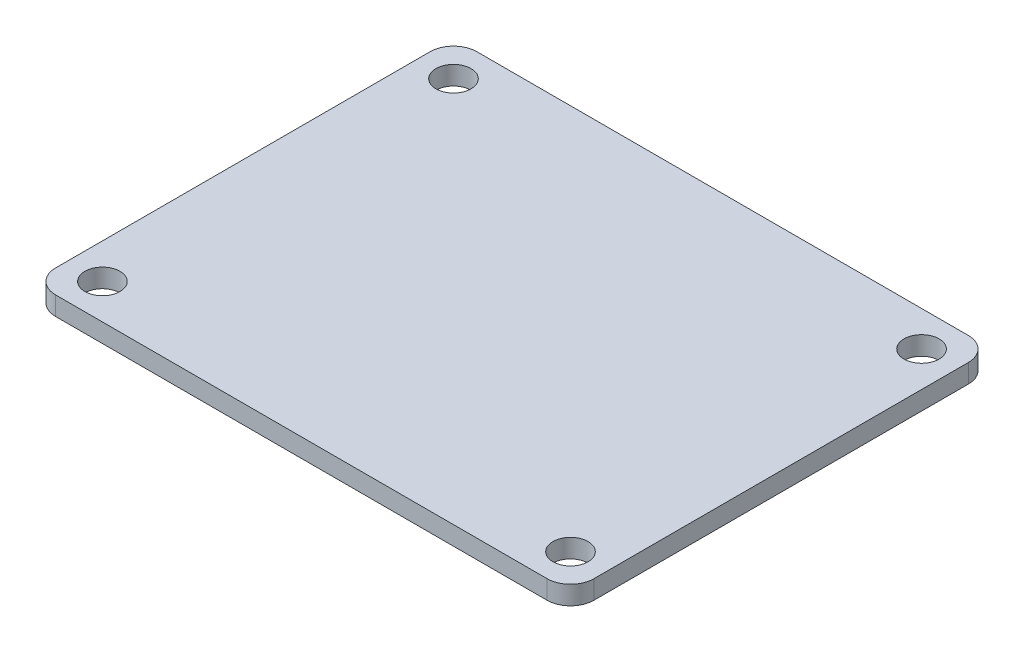
ISO-10303-21;
HEADER;
FILE_DESCRIPTION(('STEP AP214'),'2;1');
FILE_NAME('part.step','',(''),(''),'','','');
FILE_SCHEMA(('AUTOMOTIVE_DESIGN { 1 0 10303 214 1 1 1 1 }'));
ENDSEC;
DATA;
#1=APPLICATION_CONTEXT('core data for automotive mechanical design processes');
#2=APPLICATION_PROTOCOL_DEFINITION('international standard','automotive_design',2000,#1);
#3=PRODUCT_CONTEXT('',#1,'mechanical');
#4=PRODUCT('Part','Part','',(#3));
#5=PRODUCT_RELATED_PRODUCT_CATEGORY('part','',(#4));
#6=PRODUCT_DEFINITION_FORMATION('','',#4);
#7=PRODUCT_DEFINITION_CONTEXT('part definition',#1,'design');
#8=PRODUCT_DEFINITION('design','',#6,#7);
#9=PRODUCT_DEFINITION_SHAPE('','',#8);
#10=(LENGTH_UNIT() NAMED_UNIT(*) SI_UNIT(.MILLI.,.METRE.));
#11=(NAMED_UNIT(*) PLANE_ANGLE_UNIT() SI_UNIT($,.RADIAN.));
#12=(NAMED_UNIT(*) SI_UNIT($,.STERADIAN.) SOLID_ANGLE_UNIT());
#13=UNCERTAINTY_MEASURE_WITH_UNIT(LENGTH_MEASURE(1.E-05),#10,'distance_accuracy_value','');
#14=(GEOMETRIC_REPRESENTATION_CONTEXT(3) GLOBAL_UNCERTAINTY_ASSIGNED_CONTEXT((#13)) GLOBAL_UNIT_ASSIGNED_CONTEXT((#10,
#11,#12)) REPRESENTATION_CONTEXT('',''));
#15=CARTESIAN_POINT('',(0.,0.,0.));
#16=DIRECTION('',(0.,0.,1.));
#17=DIRECTION('',(1.,0.,0.));
#18=AXIS2_PLACEMENT_3D('',#15,#16,#17);
#19=CARTESIAN_POINT('',(0.,1.6,0.));
#20=DIRECTION('',(0.,-1.,0.));
#21=DIRECTION('',(0.,0.,-1.));
#22=AXIS2_PLACEMENT_3D('',#19,#20,#21);
#23=PLANE('',#22);
#24=DIRECTION('',(0.,0.,1.));
#25=VECTOR('',#24,1.);
#26=CARTESIAN_POINT('',(-23.,1.6,-18.));
#27=LINE('',#26,#25);
#28=CARTESIAN_POINT('',(-23.,1.6,-16.));
#29=VERTEX_POINT('',#28);
#30=CARTESIAN_POINT('',(-23.,1.6,16.));
#31=VERTEX_POINT('',#30);
#32=EDGE_CURVE('E171',#29,#31,#27,.T.);
#33=ORIENTED_EDGE('',*,*,#32,.T.);
#34=CARTESIAN_POINT('',(-21.,1.6,16.));
#35=DIRECTION('',(0.,-1.,0.));
#36=DIRECTION('',(0.,0.,-1.));
#37=AXIS2_PLACEMENT_3D('',#34,#35,#36);
#38=CIRCLE('',#37,2.);
#39=CARTESIAN_POINT('',(-21.,1.6,18.));
#40=VERTEX_POINT('',#39);
#41=EDGE_CURVE('E149',#31,#40,#38,.F.);
#42=ORIENTED_EDGE('',*,*,#41,.T.);
#43=DIRECTION('',(1.,0.,0.));
#44=VECTOR('',#43,1.);
#45=CARTESIAN_POINT('',(-23.,1.6,18.));
#46=LINE('',#45,#44);
#47=CARTESIAN_POINT('',(21.,1.6,18.));
#48=VERTEX_POINT('',#47);
#49=EDGE_CURVE('E119',#40,#48,#46,.T.);
#50=ORIENTED_EDGE('',*,*,#49,.T.);
#51=CARTESIAN_POINT('',(21.,1.6,16.));
#52=DIRECTION('',(0.,-1.,0.));
#53=DIRECTION('',(0.,0.,-1.));
#54=AXIS2_PLACEMENT_3D('',#51,#52,#53);
#55=CIRCLE('',#54,2.);
#56=CARTESIAN_POINT('',(23.,1.6,16.));
#57=VERTEX_POINT('',#56);
#58=EDGE_CURVE('E55',#48,#57,#55,.F.);
#59=ORIENTED_EDGE('',*,*,#58,.T.);
#60=DIRECTION('',(0.,0.,-1.));
#61=VECTOR('',#60,1.);
#62=CARTESIAN_POINT('',(23.,1.6,-18.));
#63=LINE('',#62,#61);
#64=CARTESIAN_POINT('',(23.,1.6,-16.));
#65=VERTEX_POINT('',#64);
#66=EDGE_CURVE('E135',#57,#65,#63,.T.);
#67=ORIENTED_EDGE('',*,*,#66,.T.);
#68=CARTESIAN_POINT('',(21.,1.6,-16.));
#69=DIRECTION('',(0.,-1.,0.));
#70=DIRECTION('',(0.,0.,-1.));
#71=AXIS2_PLACEMENT_3D('',#68,#69,#70);
#72=CIRCLE('',#71,2.);
#73=CARTESIAN_POINT('',(21.,1.6,-18.));
#74=VERTEX_POINT('',#73);
#75=EDGE_CURVE('E145',#65,#74,#72,.F.);
#76=ORIENTED_EDGE('',*,*,#75,.T.);
#77=DIRECTION('',(-1.,0.,0.));
#78=VECTOR('',#77,1.);
#79=CARTESIAN_POINT('',(-23.,1.6,-18.));
#80=LINE('',#79,#78);
#81=CARTESIAN_POINT('',(-21.,1.6,-18.));
#82=VERTEX_POINT('',#81);
#83=EDGE_CURVE('E129',#74,#82,#80,.T.);
#84=ORIENTED_EDGE('',*,*,#83,.T.);
#85=CARTESIAN_POINT('',(-21.,1.6,-16.));
#86=DIRECTION('',(0.,-1.,0.));
#87=DIRECTION('',(0.,0.,-1.));
#88=AXIS2_PLACEMENT_3D('',#85,#86,#87);
#89=CIRCLE('',#88,2.);
#90=EDGE_CURVE('E147',#82,#29,#89,.F.);
#91=ORIENTED_EDGE('',*,*,#90,.T.);
#92=EDGE_LOOP('',(#33,#42,#50,#59,#67,#76,#84,#91));
#93=FACE_BOUND('',#92,.T.);
#94=CARTESIAN_POINT('',(-20.,1.6,-15.));
#95=DIRECTION('',(0.,1.,0.));
#96=DIRECTION('',(0.,0.,1.));
#97=AXIS2_PLACEMENT_3D('',#94,#95,#96);
#98=CIRCLE('',#97,1.5);
#99=CARTESIAN_POINT('',(-20.,1.6,-13.5));
#100=VERTEX_POINT('',#99);
#101=EDGE_CURVE('E180',#100,#100,#98,.T.);
#102=ORIENTED_EDGE('',*,*,#101,.F.);
#103=EDGE_LOOP('',(#102));
#104=FACE_BOUND('',#103,.T.);
#105=CARTESIAN_POINT('',(20.,1.6,-15.));
#106=DIRECTION('',(0.,1.,0.));
#107=DIRECTION('',(0.,0.,-1.));
#108=AXIS2_PLACEMENT_3D('',#105,#106,#107);
#109=CIRCLE('',#108,1.49999999999998);
#110=CARTESIAN_POINT('',(20.,1.6,-16.5));
#111=VERTEX_POINT('',#110);
#112=EDGE_CURVE('E185',#111,#111,#109,.T.);
#113=ORIENTED_EDGE('',*,*,#112,.F.);
#114=EDGE_LOOP('',(#113));
#115=FACE_BOUND('',#114,.T.);
#116=CARTESIAN_POINT('',(-20.,1.6,15.));
#117=DIRECTION('',(0.,1.,0.));
#118=DIRECTION('',(0.,0.,-1.));
#119=AXIS2_PLACEMENT_3D('',#116,#117,#118);
#120=CIRCLE('',#119,1.5);
#121=CARTESIAN_POINT('',(-20.,1.6,13.5));
#122=VERTEX_POINT('',#121);
#123=EDGE_CURVE('E190',#122,#122,#120,.T.);
#124=ORIENTED_EDGE('',*,*,#123,.F.);
#125=EDGE_LOOP('',(#124));
#126=FACE_BOUND('',#125,.T.);
#127=CARTESIAN_POINT('',(20.,1.6,15.));
#128=DIRECTION('',(0.,1.,0.));
#129=DIRECTION('',(0.,0.,1.));
#130=AXIS2_PLACEMENT_3D('',#127,#128,#129);
#131=CIRCLE('',#130,1.49999999999999);
#132=CARTESIAN_POINT('',(20.,1.6,16.5));
#133=VERTEX_POINT('',#132);
#134=EDGE_CURVE('E196',#133,#133,#131,.T.);
#135=ORIENTED_EDGE('',*,*,#134,.F.);
#136=EDGE_LOOP('',(#135));
#137=FACE_BOUND('',#136,.T.);
#138=ADVANCED_FACE('F35',(#93,#104,#115,#126,#137),#23,.F.);
#139=CARTESIAN_POINT('',(0.,0.,0.));
#140=DIRECTION('',(0.,-1.,0.));
#141=DIRECTION('',(0.,0.,-1.));
#142=AXIS2_PLACEMENT_3D('',#139,#140,#141);
#143=PLANE('',#142);
#144=CARTESIAN_POINT('',(-20.,0.,15.));
#145=DIRECTION('',(0.,1.,0.));
#146=DIRECTION('',(0.,0.,-1.));
#147=AXIS2_PLACEMENT_3D('',#144,#145,#146);
#148=CIRCLE('',#147,1.5);
#149=CARTESIAN_POINT('',(-20.,0.,13.5));
#150=VERTEX_POINT('',#149);
#151=EDGE_CURVE('E193',#150,#150,#148,.T.);
#152=ORIENTED_EDGE('',*,*,#151,.T.);
#153=EDGE_LOOP('',(#152));
#154=FACE_BOUND('',#153,.T.);
#155=CARTESIAN_POINT('',(-20.,0.,-15.));
#156=DIRECTION('',(0.,1.,0.));
#157=DIRECTION('',(0.,0.,1.));
#158=AXIS2_PLACEMENT_3D('',#155,#156,#157);
#159=CIRCLE('',#158,1.5);
#160=CARTESIAN_POINT('',(-20.,0.,-13.5));
#161=VERTEX_POINT('',#160);
#162=EDGE_CURVE('E176',#161,#161,#159,.T.);
#163=ORIENTED_EDGE('',*,*,#162,.T.);
#164=EDGE_LOOP('',(#163));
#165=FACE_BOUND('',#164,.T.);
#166=DIRECTION('',(1.,0.,0.));
#167=VECTOR('',#166,1.);
#168=CARTESIAN_POINT('',(-23.,0.,18.));
#169=LINE('',#168,#167);
#170=CARTESIAN_POINT('',(-21.,0.,18.));
#171=VERTEX_POINT('',#170);
#172=CARTESIAN_POINT('',(21.,0.,18.));
#173=VERTEX_POINT('',#172);
#174=EDGE_CURVE('E117',#171,#173,#169,.T.);
#175=ORIENTED_EDGE('',*,*,#174,.F.);
#176=CARTESIAN_POINT('',(-21.,0.,16.));
#177=DIRECTION('',(0.,-1.,0.));
#178=DIRECTION('',(0.,0.,-1.));
#179=AXIS2_PLACEMENT_3D('',#176,#177,#178);
#180=CIRCLE('',#179,2.);
#181=CARTESIAN_POINT('',(-23.,0.,16.));
#182=VERTEX_POINT('',#181);
#183=EDGE_CURVE('E100',#171,#182,#180,.T.);
#184=ORIENTED_EDGE('',*,*,#183,.T.);
#185=DIRECTION('',(0.,0.,1.));
#186=VECTOR('',#185,1.);
#187=CARTESIAN_POINT('',(-23.,0.,-18.));
#188=LINE('',#187,#186);
#189=CARTESIAN_POINT('',(-23.,0.,-16.));
#190=VERTEX_POINT('',#189);
#191=EDGE_CURVE('E127',#190,#182,#188,.T.);
#192=ORIENTED_EDGE('',*,*,#191,.F.);
#193=CARTESIAN_POINT('',(-21.,0.,-16.));
#194=DIRECTION('',(0.,-1.,0.));
#195=DIRECTION('',(0.,0.,-1.));
#196=AXIS2_PLACEMENT_3D('',#193,#194,#195);
#197=CIRCLE('',#196,2.);
#198=CARTESIAN_POINT('',(-21.,0.,-18.));
#199=VERTEX_POINT('',#198);
#200=EDGE_CURVE('E111',#190,#199,#197,.T.);
#201=ORIENTED_EDGE('',*,*,#200,.T.);
#202=DIRECTION('',(-1.,0.,0.));
#203=VECTOR('',#202,1.);
#204=CARTESIAN_POINT('',(-23.,0.,-18.));
#205=LINE('',#204,#203);
#206=CARTESIAN_POINT('',(21.,0.,-18.));
#207=VERTEX_POINT('',#206);
#208=EDGE_CURVE('E131',#207,#199,#205,.T.);
#209=ORIENTED_EDGE('',*,*,#208,.F.);
#210=CARTESIAN_POINT('',(21.,0.,-16.));
#211=DIRECTION('',(0.,-1.,0.));
#212=DIRECTION('',(0.,0.,-1.));
#213=AXIS2_PLACEMENT_3D('',#210,#211,#212);
#214=CIRCLE('',#213,2.);
#215=CARTESIAN_POINT('',(23.,0.,-16.));
#216=VERTEX_POINT('',#215);
#217=EDGE_CURVE('E138',#207,#216,#214,.T.);
#218=ORIENTED_EDGE('',*,*,#217,.T.);
#219=DIRECTION('',(0.,0.,-1.));
#220=VECTOR('',#219,1.);
#221=CARTESIAN_POINT('',(23.,0.,-18.));
#222=LINE('',#221,#220);
#223=CARTESIAN_POINT('',(23.,0.,16.));
#224=VERTEX_POINT('',#223);
#225=EDGE_CURVE('E126',#224,#216,#222,.T.);
#226=ORIENTED_EDGE('',*,*,#225,.F.);
#227=CARTESIAN_POINT('',(21.,0.,16.));
#228=DIRECTION('',(0.,-1.,0.));
#229=DIRECTION('',(0.,0.,-1.));
#230=AXIS2_PLACEMENT_3D('',#227,#228,#229);
#231=CIRCLE('',#230,2.);
#232=EDGE_CURVE('E120',#224,#173,#231,.T.);
#233=ORIENTED_EDGE('',*,*,#232,.T.);
#234=EDGE_LOOP('',(#175,#184,#192,#201,#209,#218,#226,#233));
#235=FACE_BOUND('',#234,.T.);
#236=CARTESIAN_POINT('',(20.,0.,-15.));
#237=DIRECTION('',(0.,1.,0.));
#238=DIRECTION('',(0.,0.,-1.));
#239=AXIS2_PLACEMENT_3D('',#236,#237,#238);
#240=CIRCLE('',#239,1.49999999999998);
#241=CARTESIAN_POINT('',(20.,0.,-16.5));
#242=VERTEX_POINT('',#241);
#243=EDGE_CURVE('E187',#242,#242,#240,.T.);
#244=ORIENTED_EDGE('',*,*,#243,.T.);
#245=EDGE_LOOP('',(#244));
#246=FACE_BOUND('',#245,.T.);
#247=CARTESIAN_POINT('',(20.,0.,15.));
#248=DIRECTION('',(0.,1.,0.));
#249=DIRECTION('',(0.,0.,1.));
#250=AXIS2_PLACEMENT_3D('',#247,#248,#249);
#251=CIRCLE('',#250,1.49999999999999);
#252=CARTESIAN_POINT('',(20.,0.,16.5));
#253=VERTEX_POINT('',#252);
#254=EDGE_CURVE('E199',#253,#253,#251,.T.);
#255=ORIENTED_EDGE('',*,*,#254,.T.);
#256=EDGE_LOOP('',(#255));
#257=FACE_BOUND('',#256,.T.);
#258=ADVANCED_FACE('F123',(#154,#165,#235,#246,#257),#143,.T.);
#259=CARTESIAN_POINT('',(-23.,1.6,-18.));
#260=DIRECTION('',(0.,0.,1.));
#261=DIRECTION('',(1.,0.,0.));
#262=AXIS2_PLACEMENT_3D('',#259,#260,#261);
#263=PLANE('',#262);
#264=ORIENTED_EDGE('',*,*,#208,.T.);
#265=DIRECTION('',(0.,-1.,0.));
#266=VECTOR('',#265,1.);
#267=CARTESIAN_POINT('',(-21.,1.6,-18.));
#268=LINE('',#267,#266);
#269=EDGE_CURVE('E154',#199,#82,#268,.F.);
#270=ORIENTED_EDGE('',*,*,#269,.T.);
#271=ORIENTED_EDGE('',*,*,#83,.F.);
#272=DIRECTION('',(0.,-1.,0.));
#273=VECTOR('',#272,1.);
#274=CARTESIAN_POINT('',(21.,1.6,-18.));
#275=LINE('',#274,#273);
#276=EDGE_CURVE('E151',#74,#207,#275,.T.);
#277=ORIENTED_EDGE('',*,*,#276,.T.);
#278=EDGE_LOOP('',(#264,#270,#271,#277));
#279=FACE_BOUND('',#278,.T.);
#280=ADVANCED_FACE('F167',(#279),#263,.F.);
#281=CARTESIAN_POINT('',(-23.,1.6,-18.));
#282=DIRECTION('',(1.,0.,0.));
#283=DIRECTION('',(0.,0.,-1.));
#284=AXIS2_PLACEMENT_3D('',#281,#282,#283);
#285=PLANE('',#284);
#286=ORIENTED_EDGE('',*,*,#191,.T.);
#287=DIRECTION('',(0.,-1.,0.));
#288=VECTOR('',#287,1.);
#289=CARTESIAN_POINT('',(-23.,1.6,16.));
#290=LINE('',#289,#288);
#291=EDGE_CURVE('E105',#182,#31,#290,.F.);
#292=ORIENTED_EDGE('',*,*,#291,.T.);
#293=ORIENTED_EDGE('',*,*,#32,.F.);
#294=DIRECTION('',(0.,-1.,0.));
#295=VECTOR('',#294,1.);
#296=CARTESIAN_POINT('',(-23.,1.6,-16.));
#297=LINE('',#296,#295);
#298=EDGE_CURVE('E110',#29,#190,#297,.T.);
#299=ORIENTED_EDGE('',*,*,#298,.T.);
#300=EDGE_LOOP('',(#286,#292,#293,#299));
#301=FACE_BOUND('',#300,.T.);
#302=ADVANCED_FACE('F224',(#301),#285,.F.);
#303=CARTESIAN_POINT('',(-23.,1.6,18.));
#304=DIRECTION('',(0.,0.,-1.));
#305=DIRECTION('',(-1.,0.,0.));
#306=AXIS2_PLACEMENT_3D('',#303,#304,#305);
#307=PLANE('',#306);
#308=ORIENTED_EDGE('',*,*,#49,.F.);
#309=DIRECTION('',(0.,-1.,0.));
#310=VECTOR('',#309,1.);
#311=CARTESIAN_POINT('',(-21.,1.6,18.));
#312=LINE('',#311,#310);
#313=EDGE_CURVE('E104',#40,#171,#312,.T.);
#314=ORIENTED_EDGE('',*,*,#313,.T.);
#315=ORIENTED_EDGE('',*,*,#174,.T.);
#316=DIRECTION('',(0.,-1.,0.));
#317=VECTOR('',#316,1.);
#318=CARTESIAN_POINT('',(21.,1.6,18.));
#319=LINE('',#318,#317);
#320=EDGE_CURVE('E121',#173,#48,#319,.F.);
#321=ORIENTED_EDGE('',*,*,#320,.T.);
#322=EDGE_LOOP('',(#308,#314,#315,#321));
#323=FACE_BOUND('',#322,.T.);
#324=ADVANCED_FACE('F116',(#323),#307,.F.);
#325=CARTESIAN_POINT('',(23.,1.6,-18.));
#326=DIRECTION('',(-1.,0.,0.));
#327=DIRECTION('',(0.,0.,1.));
#328=AXIS2_PLACEMENT_3D('',#325,#326,#327);
#329=PLANE('',#328);
#330=ORIENTED_EDGE('',*,*,#225,.T.);
#331=DIRECTION('',(0.,-1.,0.));
#332=VECTOR('',#331,1.);
#333=CARTESIAN_POINT('',(23.,1.6,-16.));
#334=LINE('',#333,#332);
#335=EDGE_CURVE('E11',#216,#65,#334,.F.);
#336=ORIENTED_EDGE('',*,*,#335,.T.);
#337=ORIENTED_EDGE('',*,*,#66,.F.);
#338=DIRECTION('',(0.,-1.,0.));
#339=VECTOR('',#338,1.);
#340=CARTESIAN_POINT('',(23.,1.6,16.));
#341=LINE('',#340,#339);
#342=EDGE_CURVE('E43',#57,#224,#341,.T.);
#343=ORIENTED_EDGE('',*,*,#342,.T.);
#344=EDGE_LOOP('',(#330,#336,#337,#343));
#345=FACE_BOUND('',#344,.T.);
#346=ADVANCED_FACE('F157',(#345),#329,.F.);
#347=CARTESIAN_POINT('',(-20.,1.6,-15.));
#348=DIRECTION('',(0.,-1.,0.));
#349=DIRECTION('',(0.,0.,-1.));
#350=AXIS2_PLACEMENT_3D('',#347,#348,#349);
#351=CYLINDRICAL_SURFACE('',#350,1.5);
#352=ORIENTED_EDGE('',*,*,#101,.T.);
#353=EDGE_LOOP('',(#352));
#354=FACE_BOUND('',#353,.T.);
#355=ORIENTED_EDGE('',*,*,#162,.F.);
#356=EDGE_LOOP('',(#355));
#357=FACE_BOUND('',#356,.T.);
#358=ADVANCED_FACE('F217',(#354,#357),#351,.F.);
#359=CARTESIAN_POINT('',(20.,1.6,-15.));
#360=DIRECTION('',(0.,-1.,0.));
#361=DIRECTION('',(0.,0.,-1.));
#362=AXIS2_PLACEMENT_3D('',#359,#360,#361);
#363=CYLINDRICAL_SURFACE('',#362,1.49999999999998);
#364=ORIENTED_EDGE('',*,*,#112,.T.);
#365=EDGE_LOOP('',(#364));
#366=FACE_BOUND('',#365,.T.);
#367=ORIENTED_EDGE('',*,*,#243,.F.);
#368=EDGE_LOOP('',(#367));
#369=FACE_BOUND('',#368,.T.);
#370=ADVANCED_FACE('F313',(#366,#369),#363,.F.);
#371=CARTESIAN_POINT('',(-20.,1.6,15.));
#372=DIRECTION('',(0.,-1.,0.));
#373=DIRECTION('',(0.,0.,-1.));
#374=AXIS2_PLACEMENT_3D('',#371,#372,#373);
#375=CYLINDRICAL_SURFACE('',#374,1.5);
#376=ORIENTED_EDGE('',*,*,#123,.T.);
#377=EDGE_LOOP('',(#376));
#378=FACE_BOUND('',#377,.T.);
#379=ORIENTED_EDGE('',*,*,#151,.F.);
#380=EDGE_LOOP('',(#379));
#381=FACE_BOUND('',#380,.T.);
#382=ADVANCED_FACE('F304',(#378,#381),#375,.F.);
#383=CARTESIAN_POINT('',(20.,1.6,15.));
#384=DIRECTION('',(0.,-1.,0.));
#385=DIRECTION('',(0.,0.,-1.));
#386=AXIS2_PLACEMENT_3D('',#383,#384,#385);
#387=CYLINDRICAL_SURFACE('',#386,1.49999999999999);
#388=ORIENTED_EDGE('',*,*,#134,.T.);
#389=EDGE_LOOP('',(#388));
#390=FACE_BOUND('',#389,.T.);
#391=ORIENTED_EDGE('',*,*,#254,.F.);
#392=EDGE_LOOP('',(#391));
#393=FACE_BOUND('',#392,.T.);
#394=ADVANCED_FACE('F205',(#390,#393),#387,.F.);
#395=CARTESIAN_POINT('',(-21.,1.6,16.));
#396=DIRECTION('',(0.,-1.,0.));
#397=DIRECTION('',(0.,0.,-1.));
#398=AXIS2_PLACEMENT_3D('',#395,#396,#397);
#399=CYLINDRICAL_SURFACE('',#398,2.);
#400=ORIENTED_EDGE('',*,*,#41,.F.);
#401=ORIENTED_EDGE('',*,*,#291,.F.);
#402=ORIENTED_EDGE('',*,*,#183,.F.);
#403=ORIENTED_EDGE('',*,*,#313,.F.);
#404=EDGE_LOOP('',(#400,#401,#402,#403));
#405=FACE_BOUND('',#404,.T.);
#406=ADVANCED_FACE('F103',(#405),#399,.T.);
#407=CARTESIAN_POINT('',(-21.,1.6,-16.));
#408=DIRECTION('',(0.,-1.,0.));
#409=DIRECTION('',(0.,0.,-1.));
#410=AXIS2_PLACEMENT_3D('',#407,#408,#409);
#411=CYLINDRICAL_SURFACE('',#410,2.);
#412=ORIENTED_EDGE('',*,*,#90,.F.);
#413=ORIENTED_EDGE('',*,*,#269,.F.);
#414=ORIENTED_EDGE('',*,*,#200,.F.);
#415=ORIENTED_EDGE('',*,*,#298,.F.);
#416=EDGE_LOOP('',(#412,#413,#414,#415));
#417=FACE_BOUND('',#416,.T.);
#418=ADVANCED_FACE('F232',(#417),#411,.T.);
#419=CARTESIAN_POINT('',(21.,1.6,-16.));
#420=DIRECTION('',(0.,-1.,0.));
#421=DIRECTION('',(0.,0.,-1.));
#422=AXIS2_PLACEMENT_3D('',#419,#420,#421);
#423=CYLINDRICAL_SURFACE('',#422,2.);
#424=ORIENTED_EDGE('',*,*,#75,.F.);
#425=ORIENTED_EDGE('',*,*,#335,.F.);
#426=ORIENTED_EDGE('',*,*,#217,.F.);
#427=ORIENTED_EDGE('',*,*,#276,.F.);
#428=EDGE_LOOP('',(#424,#425,#426,#427));
#429=FACE_BOUND('',#428,.T.);
#430=ADVANCED_FACE('F164',(#429),#423,.T.);
#431=CARTESIAN_POINT('',(21.,1.6,16.));
#432=DIRECTION('',(0.,-1.,0.));
#433=DIRECTION('',(0.,0.,-1.));
#434=AXIS2_PLACEMENT_3D('',#431,#432,#433);
#435=CYLINDRICAL_SURFACE('',#434,2.);
#436=ORIENTED_EDGE('',*,*,#58,.F.);
#437=ORIENTED_EDGE('',*,*,#320,.F.);
#438=ORIENTED_EDGE('',*,*,#232,.F.);
#439=ORIENTED_EDGE('',*,*,#342,.F.);
#440=EDGE_LOOP('',(#436,#437,#438,#439));
#441=FACE_BOUND('',#440,.T.);
#442=ADVANCED_FACE('F37',(#441),#435,.T.);
#443=CLOSED_SHELL('',(#138,#258,#280,#302,#324,#346,#358,#370,#382,#394,#406,#418,#430,#442));
#444=MANIFOLD_SOLID_BREP('B2',#443);
#445=ADVANCED_BREP_SHAPE_REPRESENTATION('',(#18,#444),#14);
#446=SHAPE_DEFINITION_REPRESENTATION(#9,#445);
ENDSEC;
END-ISO-10303-21;
